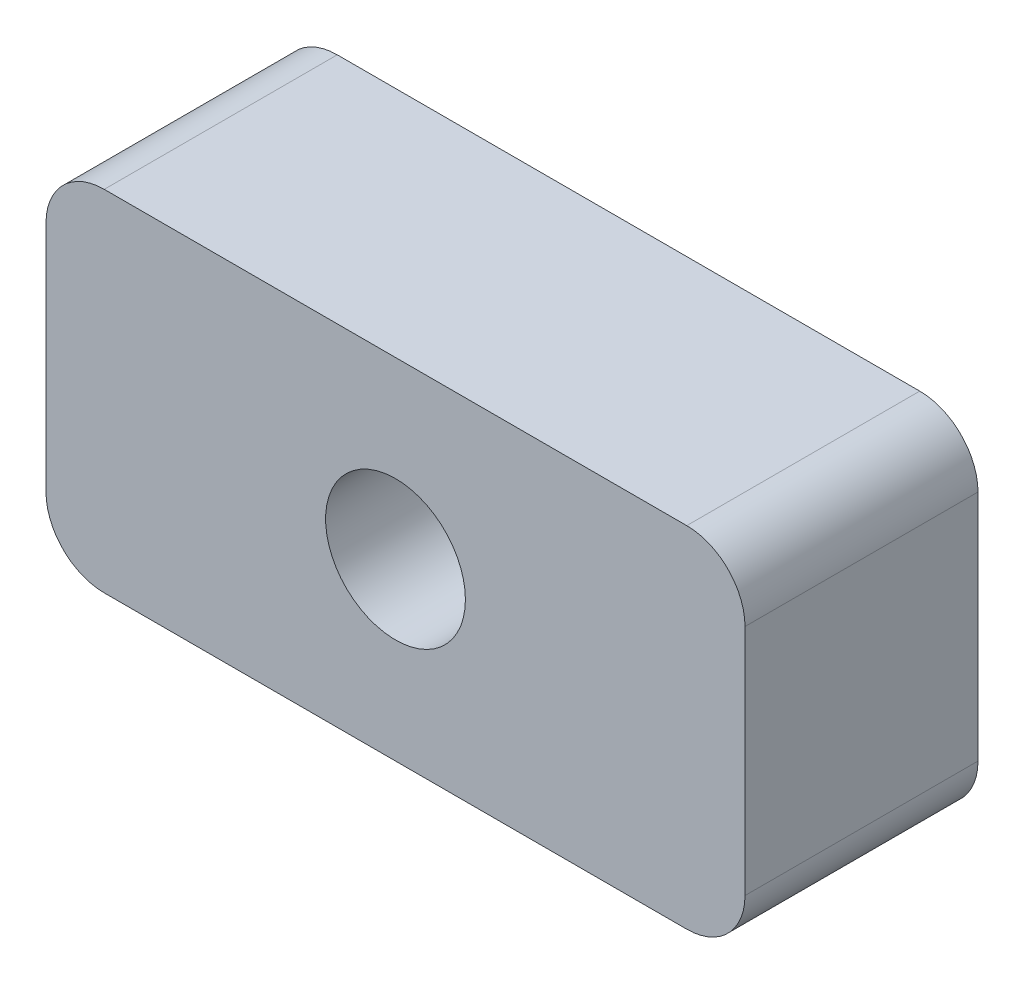
ISO-10303-21;
HEADER;
FILE_DESCRIPTION(('STEP AP214'),'2;1');
FILE_NAME('part.step','',(''),(''),'','','');
FILE_SCHEMA(('AUTOMOTIVE_DESIGN { 1 0 10303 214 1 1 1 1 }'));
ENDSEC;
DATA;
#1=APPLICATION_CONTEXT('core data for automotive mechanical design processes');
#2=APPLICATION_PROTOCOL_DEFINITION('international standard','automotive_design',2000,#1);
#3=PRODUCT_CONTEXT('',#1,'mechanical');
#4=PRODUCT('Part','Part','',(#3));
#5=PRODUCT_RELATED_PRODUCT_CATEGORY('part','',(#4));
#6=PRODUCT_DEFINITION_FORMATION('','',#4);
#7=PRODUCT_DEFINITION_CONTEXT('part definition',#1,'design');
#8=PRODUCT_DEFINITION('design','',#6,#7);
#9=PRODUCT_DEFINITION_SHAPE('','',#8);
#10=(LENGTH_UNIT() NAMED_UNIT(*) SI_UNIT(.MILLI.,.METRE.));
#11=(NAMED_UNIT(*) PLANE_ANGLE_UNIT() SI_UNIT($,.RADIAN.));
#12=(NAMED_UNIT(*) SI_UNIT($,.STERADIAN.) SOLID_ANGLE_UNIT());
#13=UNCERTAINTY_MEASURE_WITH_UNIT(LENGTH_MEASURE(1.E-05),#10,'distance_accuracy_value','');
#14=(GEOMETRIC_REPRESENTATION_CONTEXT(3) GLOBAL_UNCERTAINTY_ASSIGNED_CONTEXT((#13)) GLOBAL_UNIT_ASSIGNED_CONTEXT((#10,
#11,#12)) REPRESENTATION_CONTEXT('',''));
#15=CARTESIAN_POINT('',(0.,0.,0.));
#16=DIRECTION('',(0.,0.,1.));
#17=DIRECTION('',(1.,0.,0.));
#18=AXIS2_PLACEMENT_3D('',#15,#16,#17);
#19=CARTESIAN_POINT('',(0.,0.,0.));
#20=DIRECTION('',(0.,0.,1.));
#21=DIRECTION('',(1.,0.,0.));
#22=AXIS2_PLACEMENT_3D('',#19,#20,#21);
#23=PLANE('',#22);
#24=CARTESIAN_POINT('',(0.,0.,0.));
#25=DIRECTION('',(0.,0.,1.));
#26=DIRECTION('',(1.,0.,0.));
#27=AXIS2_PLACEMENT_3D('',#24,#25,#26);
#28=CIRCLE('',#27,3.);
#29=CARTESIAN_POINT('',(3.,0.,0.));
#30=VERTEX_POINT('',#29);
#31=EDGE_CURVE('E129',#30,#30,#28,.T.);
#32=ORIENTED_EDGE('',*,*,#31,.T.);
#33=EDGE_LOOP('',(#32));
#34=FACE_BOUND('',#33,.T.);
#35=DIRECTION('',(0.,1.,0.));
#36=VECTOR('',#35,1.);
#37=CARTESIAN_POINT('',(15.,5.,0.));
#38=LINE('',#37,#36);
#39=CARTESIAN_POINT('',(15.,-5.,0.));
#40=VERTEX_POINT('',#39);
#41=CARTESIAN_POINT('',(15.,5.,0.));
#42=VERTEX_POINT('',#41);
#43=EDGE_CURVE('E78',#40,#42,#38,.T.);
#44=ORIENTED_EDGE('',*,*,#43,.F.);
#45=CARTESIAN_POINT('',(12.5,-5.,0.));
#46=DIRECTION('',(0.,0.,1.));
#47=DIRECTION('',(1.,0.,0.));
#48=AXIS2_PLACEMENT_3D('',#45,#46,#47);
#49=CIRCLE('',#48,2.5);
#50=CARTESIAN_POINT('',(12.5,-7.5,0.));
#51=VERTEX_POINT('',#50);
#52=EDGE_CURVE('E133',#51,#40,#49,.T.);
#53=ORIENTED_EDGE('',*,*,#52,.F.);
#54=DIRECTION('',(1.,0.,0.));
#55=VECTOR('',#54,1.);
#56=CARTESIAN_POINT('',(12.5,-7.5,0.));
#57=LINE('',#56,#55);
#58=CARTESIAN_POINT('',(-12.5,-7.5,0.));
#59=VERTEX_POINT('',#58);
#60=EDGE_CURVE('E109',#59,#51,#57,.T.);
#61=ORIENTED_EDGE('',*,*,#60,.F.);
#62=CARTESIAN_POINT('',(-12.5,-5.,0.));
#63=DIRECTION('',(0.,0.,1.));
#64=DIRECTION('',(1.,0.,0.));
#65=AXIS2_PLACEMENT_3D('',#62,#63,#64);
#66=CIRCLE('',#65,2.5);
#67=CARTESIAN_POINT('',(-15.,-5.,0.));
#68=VERTEX_POINT('',#67);
#69=EDGE_CURVE('E136',#68,#59,#66,.T.);
#70=ORIENTED_EDGE('',*,*,#69,.F.);
#71=DIRECTION('',(0.,1.,0.));
#72=VECTOR('',#71,1.);
#73=CARTESIAN_POINT('',(-15.,-5.,0.));
#74=LINE('',#73,#72);
#75=CARTESIAN_POINT('',(-15.,5.,0.));
#76=VERTEX_POINT('',#75);
#77=EDGE_CURVE('E112',#76,#68,#74,.F.);
#78=ORIENTED_EDGE('',*,*,#77,.F.);
#79=CARTESIAN_POINT('',(-12.5,5.,0.));
#80=DIRECTION('',(0.,0.,1.));
#81=DIRECTION('',(1.,0.,0.));
#82=AXIS2_PLACEMENT_3D('',#79,#80,#81);
#83=CIRCLE('',#82,2.5);
#84=CARTESIAN_POINT('',(-12.5,7.5,0.));
#85=VERTEX_POINT('',#84);
#86=EDGE_CURVE('E94',#85,#76,#83,.T.);
#87=ORIENTED_EDGE('',*,*,#86,.F.);
#88=DIRECTION('',(1.,0.,0.));
#89=VECTOR('',#88,1.);
#90=CARTESIAN_POINT('',(-12.5,7.5,0.));
#91=LINE('',#90,#89);
#92=CARTESIAN_POINT('',(12.5,7.5,0.));
#93=VERTEX_POINT('',#92);
#94=EDGE_CURVE('E92',#93,#85,#91,.F.);
#95=ORIENTED_EDGE('',*,*,#94,.F.);
#96=CARTESIAN_POINT('',(12.5,5.,0.));
#97=DIRECTION('',(0.,0.,1.));
#98=DIRECTION('',(1.,0.,0.));
#99=AXIS2_PLACEMENT_3D('',#96,#97,#98);
#100=CIRCLE('',#99,2.5);
#101=EDGE_CURVE('E20',#42,#93,#100,.T.);
#102=ORIENTED_EDGE('',*,*,#101,.F.);
#103=EDGE_LOOP('',(#44,#53,#61,#70,#78,#87,#95,#102));
#104=FACE_BOUND('',#103,.T.);
#105=ADVANCED_FACE('F17',(#34,#104),#23,.F.);
#106=CARTESIAN_POINT('',(15.,5.,0.));
#107=DIRECTION('',(1.,0.,0.));
#108=DIRECTION('',(0.,0.,-1.));
#109=AXIS2_PLACEMENT_3D('',#106,#107,#108);
#110=PLANE('',#109);
#111=ORIENTED_EDGE('',*,*,#43,.T.);
#112=DIRECTION('',(0.,0.,1.));
#113=VECTOR('',#112,1.);
#114=CARTESIAN_POINT('',(15.,5.,0.));
#115=LINE('',#114,#113);
#116=CARTESIAN_POINT('',(15.,5.,10.));
#117=VERTEX_POINT('',#116);
#118=EDGE_CURVE('E89',#117,#42,#115,.F.);
#119=ORIENTED_EDGE('',*,*,#118,.F.);
#120=DIRECTION('',(0.,1.,0.));
#121=VECTOR('',#120,1.);
#122=CARTESIAN_POINT('',(15.,0.,10.));
#123=LINE('',#122,#121);
#124=CARTESIAN_POINT('',(15.,-5.,10.));
#125=VERTEX_POINT('',#124);
#126=EDGE_CURVE('E128',#125,#117,#123,.T.);
#127=ORIENTED_EDGE('',*,*,#126,.F.);
#128=DIRECTION('',(0.,0.,1.));
#129=VECTOR('',#128,1.);
#130=CARTESIAN_POINT('',(15.,-5.,0.));
#131=LINE('',#130,#129);
#132=EDGE_CURVE('E132',#40,#125,#131,.T.);
#133=ORIENTED_EDGE('',*,*,#132,.F.);
#134=EDGE_LOOP('',(#111,#119,#127,#133));
#135=FACE_BOUND('',#134,.T.);
#136=ADVANCED_FACE('F169',(#135),#110,.T.);
#137=CARTESIAN_POINT('',(12.5,5.,0.));
#138=DIRECTION('',(0.,0.,1.));
#139=DIRECTION('',(1.,0.,0.));
#140=AXIS2_PLACEMENT_3D('',#137,#138,#139);
#141=CYLINDRICAL_SURFACE('',#140,2.5);
#142=ORIENTED_EDGE('',*,*,#101,.T.);
#143=DIRECTION('',(0.,0.,1.));
#144=VECTOR('',#143,1.);
#145=CARTESIAN_POINT('',(12.5,7.5,0.));
#146=LINE('',#145,#144);
#147=CARTESIAN_POINT('',(12.5,7.5,10.));
#148=VERTEX_POINT('',#147);
#149=EDGE_CURVE('E87',#148,#93,#146,.F.);
#150=ORIENTED_EDGE('',*,*,#149,.F.);
#151=CARTESIAN_POINT('',(12.5,5.,10.));
#152=DIRECTION('',(0.,0.,1.));
#153=DIRECTION('',(1.,0.,0.));
#154=AXIS2_PLACEMENT_3D('',#151,#152,#153);
#155=CIRCLE('',#154,2.5);
#156=EDGE_CURVE('E126',#117,#148,#155,.T.);
#157=ORIENTED_EDGE('',*,*,#156,.F.);
#158=ORIENTED_EDGE('',*,*,#118,.T.);
#159=EDGE_LOOP('',(#142,#150,#157,#158));
#160=FACE_BOUND('',#159,.T.);
#161=ADVANCED_FACE('F84',(#160),#141,.T.);
#162=CARTESIAN_POINT('',(-12.5,7.5,0.));
#163=DIRECTION('',(0.,1.,0.));
#164=DIRECTION('',(0.,0.,1.));
#165=AXIS2_PLACEMENT_3D('',#162,#163,#164);
#166=PLANE('',#165);
#167=ORIENTED_EDGE('',*,*,#94,.T.);
#168=DIRECTION('',(0.,0.,1.));
#169=VECTOR('',#168,1.);
#170=CARTESIAN_POINT('',(-12.5,7.5,0.));
#171=LINE('',#170,#169);
#172=CARTESIAN_POINT('',(-12.5,7.5,10.));
#173=VERTEX_POINT('',#172);
#174=EDGE_CURVE('E97',#173,#85,#171,.F.);
#175=ORIENTED_EDGE('',*,*,#174,.F.);
#176=DIRECTION('',(1.,0.,0.));
#177=VECTOR('',#176,1.);
#178=CARTESIAN_POINT('',(0.,7.5,10.));
#179=LINE('',#178,#177);
#180=EDGE_CURVE('E101',#148,#173,#179,.F.);
#181=ORIENTED_EDGE('',*,*,#180,.F.);
#182=ORIENTED_EDGE('',*,*,#149,.T.);
#183=EDGE_LOOP('',(#167,#175,#181,#182));
#184=FACE_BOUND('',#183,.T.);
#185=ADVANCED_FACE('F99',(#184),#166,.T.);
#186=CARTESIAN_POINT('',(-12.5,5.,0.));
#187=DIRECTION('',(0.,0.,1.));
#188=DIRECTION('',(1.,0.,0.));
#189=AXIS2_PLACEMENT_3D('',#186,#187,#188);
#190=CYLINDRICAL_SURFACE('',#189,2.5);
#191=ORIENTED_EDGE('',*,*,#86,.T.);
#192=DIRECTION('',(0.,0.,1.));
#193=VECTOR('',#192,1.);
#194=CARTESIAN_POINT('',(-15.,5.,0.));
#195=LINE('',#194,#193);
#196=CARTESIAN_POINT('',(-15.,5.,10.));
#197=VERTEX_POINT('',#196);
#198=EDGE_CURVE('E114',#197,#76,#195,.F.);
#199=ORIENTED_EDGE('',*,*,#198,.F.);
#200=CARTESIAN_POINT('',(-12.5,5.,10.));
#201=DIRECTION('',(0.,0.,1.));
#202=DIRECTION('',(1.,0.,0.));
#203=AXIS2_PLACEMENT_3D('',#200,#201,#202);
#204=CIRCLE('',#203,2.5);
#205=EDGE_CURVE('E123',#173,#197,#204,.T.);
#206=ORIENTED_EDGE('',*,*,#205,.F.);
#207=ORIENTED_EDGE('',*,*,#174,.T.);
#208=EDGE_LOOP('',(#191,#199,#206,#207));
#209=FACE_BOUND('',#208,.T.);
#210=ADVANCED_FACE('F140',(#209),#190,.T.);
#211=CARTESIAN_POINT('',(-15.,-5.,0.));
#212=DIRECTION('',(-1.,0.,0.));
#213=DIRECTION('',(0.,0.,1.));
#214=AXIS2_PLACEMENT_3D('',#211,#212,#213);
#215=PLANE('',#214);
#216=ORIENTED_EDGE('',*,*,#77,.T.);
#217=DIRECTION('',(0.,0.,1.));
#218=VECTOR('',#217,1.);
#219=CARTESIAN_POINT('',(-15.,-5.,0.));
#220=LINE('',#219,#218);
#221=CARTESIAN_POINT('',(-15.,-5.,10.));
#222=VERTEX_POINT('',#221);
#223=EDGE_CURVE('E113',#222,#68,#220,.F.);
#224=ORIENTED_EDGE('',*,*,#223,.F.);
#225=DIRECTION('',(0.,1.,0.));
#226=VECTOR('',#225,1.);
#227=CARTESIAN_POINT('',(-15.,0.,10.));
#228=LINE('',#227,#226);
#229=EDGE_CURVE('E122',#197,#222,#228,.F.);
#230=ORIENTED_EDGE('',*,*,#229,.F.);
#231=ORIENTED_EDGE('',*,*,#198,.T.);
#232=EDGE_LOOP('',(#216,#224,#230,#231));
#233=FACE_BOUND('',#232,.T.);
#234=ADVANCED_FACE('F164',(#233),#215,.T.);
#235=CARTESIAN_POINT('',(-12.5,-5.,0.));
#236=DIRECTION('',(0.,0.,1.));
#237=DIRECTION('',(1.,0.,0.));
#238=AXIS2_PLACEMENT_3D('',#235,#236,#237);
#239=CYLINDRICAL_SURFACE('',#238,2.5);
#240=ORIENTED_EDGE('',*,*,#69,.T.);
#241=DIRECTION('',(0.,0.,-1.));
#242=VECTOR('',#241,1.);
#243=CARTESIAN_POINT('',(-12.5,-7.5,0.));
#244=LINE('',#243,#242);
#245=CARTESIAN_POINT('',(-12.5,-7.5,10.));
#246=VERTEX_POINT('',#245);
#247=EDGE_CURVE('E111',#246,#59,#244,.T.);
#248=ORIENTED_EDGE('',*,*,#247,.F.);
#249=CARTESIAN_POINT('',(-12.5,-5.,10.));
#250=DIRECTION('',(0.,0.,1.));
#251=DIRECTION('',(1.,0.,0.));
#252=AXIS2_PLACEMENT_3D('',#249,#250,#251);
#253=CIRCLE('',#252,2.5);
#254=EDGE_CURVE('E119',#222,#246,#253,.T.);
#255=ORIENTED_EDGE('',*,*,#254,.F.);
#256=ORIENTED_EDGE('',*,*,#223,.T.);
#257=EDGE_LOOP('',(#240,#248,#255,#256));
#258=FACE_BOUND('',#257,.T.);
#259=ADVANCED_FACE('F160',(#258),#239,.T.);
#260=CARTESIAN_POINT('',(12.5,-7.5,0.));
#261=DIRECTION('',(0.,-1.,0.));
#262=DIRECTION('',(0.,0.,-1.));
#263=AXIS2_PLACEMENT_3D('',#260,#261,#262);
#264=PLANE('',#263);
#265=ORIENTED_EDGE('',*,*,#60,.T.);
#266=DIRECTION('',(0.,0.,1.));
#267=VECTOR('',#266,1.);
#268=CARTESIAN_POINT('',(12.5,-7.5,0.));
#269=LINE('',#268,#267);
#270=CARTESIAN_POINT('',(12.5,-7.5,10.));
#271=VERTEX_POINT('',#270);
#272=EDGE_CURVE('E35',#271,#51,#269,.F.);
#273=ORIENTED_EDGE('',*,*,#272,.F.);
#274=DIRECTION('',(1.,0.,0.));
#275=VECTOR('',#274,1.);
#276=CARTESIAN_POINT('',(0.,-7.5,10.));
#277=LINE('',#276,#275);
#278=EDGE_CURVE('E118',#246,#271,#277,.T.);
#279=ORIENTED_EDGE('',*,*,#278,.F.);
#280=ORIENTED_EDGE('',*,*,#247,.T.);
#281=EDGE_LOOP('',(#265,#273,#279,#280));
#282=FACE_BOUND('',#281,.T.);
#283=ADVANCED_FACE('F166',(#282),#264,.T.);
#284=CARTESIAN_POINT('',(12.5,-5.,0.));
#285=DIRECTION('',(0.,0.,1.));
#286=DIRECTION('',(1.,0.,0.));
#287=AXIS2_PLACEMENT_3D('',#284,#285,#286);
#288=CYLINDRICAL_SURFACE('',#287,2.5);
#289=ORIENTED_EDGE('',*,*,#52,.T.);
#290=ORIENTED_EDGE('',*,*,#132,.T.);
#291=CARTESIAN_POINT('',(12.5,-5.,10.));
#292=DIRECTION('',(0.,0.,1.));
#293=DIRECTION('',(1.,0.,0.));
#294=AXIS2_PLACEMENT_3D('',#291,#292,#293);
#295=CIRCLE('',#294,2.5);
#296=EDGE_CURVE('E26',#271,#125,#295,.T.);
#297=ORIENTED_EDGE('',*,*,#296,.F.);
#298=ORIENTED_EDGE('',*,*,#272,.T.);
#299=EDGE_LOOP('',(#289,#290,#297,#298));
#300=FACE_BOUND('',#299,.T.);
#301=ADVANCED_FACE('F168',(#300),#288,.T.);
#302=CARTESIAN_POINT('',(0.,0.,0.));
#303=DIRECTION('',(0.,0.,1.));
#304=DIRECTION('',(1.,0.,0.));
#305=AXIS2_PLACEMENT_3D('',#302,#303,#304);
#306=CYLINDRICAL_SURFACE('',#305,3.);
#307=ORIENTED_EDGE('',*,*,#31,.F.);
#308=EDGE_LOOP('',(#307));
#309=FACE_BOUND('',#308,.T.);
#310=CARTESIAN_POINT('',(0.,0.,10.));
#311=DIRECTION('',(0.,0.,1.));
#312=DIRECTION('',(1.,0.,0.));
#313=AXIS2_PLACEMENT_3D('',#310,#311,#312);
#314=CIRCLE('',#313,3.);
#315=CARTESIAN_POINT('',(3.,0.,10.));
#316=VERTEX_POINT('',#315);
#317=EDGE_CURVE('E11',#316,#316,#314,.F.);
#318=ORIENTED_EDGE('',*,*,#317,.F.);
#319=EDGE_LOOP('',(#318));
#320=FACE_BOUND('',#319,.T.);
#321=ADVANCED_FACE('F179',(#309,#320),#306,.F.);
#322=CARTESIAN_POINT('',(0.,0.,10.));
#323=DIRECTION('',(0.,0.,1.));
#324=DIRECTION('',(1.,0.,0.));
#325=AXIS2_PLACEMENT_3D('',#322,#323,#324);
#326=PLANE('',#325);
#327=ORIENTED_EDGE('',*,*,#317,.T.);
#328=EDGE_LOOP('',(#327));
#329=FACE_BOUND('',#328,.T.);
#330=ORIENTED_EDGE('',*,*,#278,.T.);
#331=ORIENTED_EDGE('',*,*,#296,.T.);
#332=ORIENTED_EDGE('',*,*,#126,.T.);
#333=ORIENTED_EDGE('',*,*,#156,.T.);
#334=ORIENTED_EDGE('',*,*,#180,.T.);
#335=ORIENTED_EDGE('',*,*,#205,.T.);
#336=ORIENTED_EDGE('',*,*,#229,.T.);
#337=ORIENTED_EDGE('',*,*,#254,.T.);
#338=EDGE_LOOP('',(#330,#331,#332,#333,#334,#335,#336,#337));
#339=FACE_BOUND('',#338,.T.);
#340=ADVANCED_FACE('F145',(#329,#339),#326,.T.);
#341=CLOSED_SHELL('',(#105,#136,#161,#185,#210,#234,#259,#283,#301,#321,#340));
#342=MANIFOLD_SOLID_BREP('B1',#341);
#343=ADVANCED_BREP_SHAPE_REPRESENTATION('',(#18,#342),#14);
#344=SHAPE_DEFINITION_REPRESENTATION(#9,#343);
ENDSEC;
END-ISO-10303-21;
